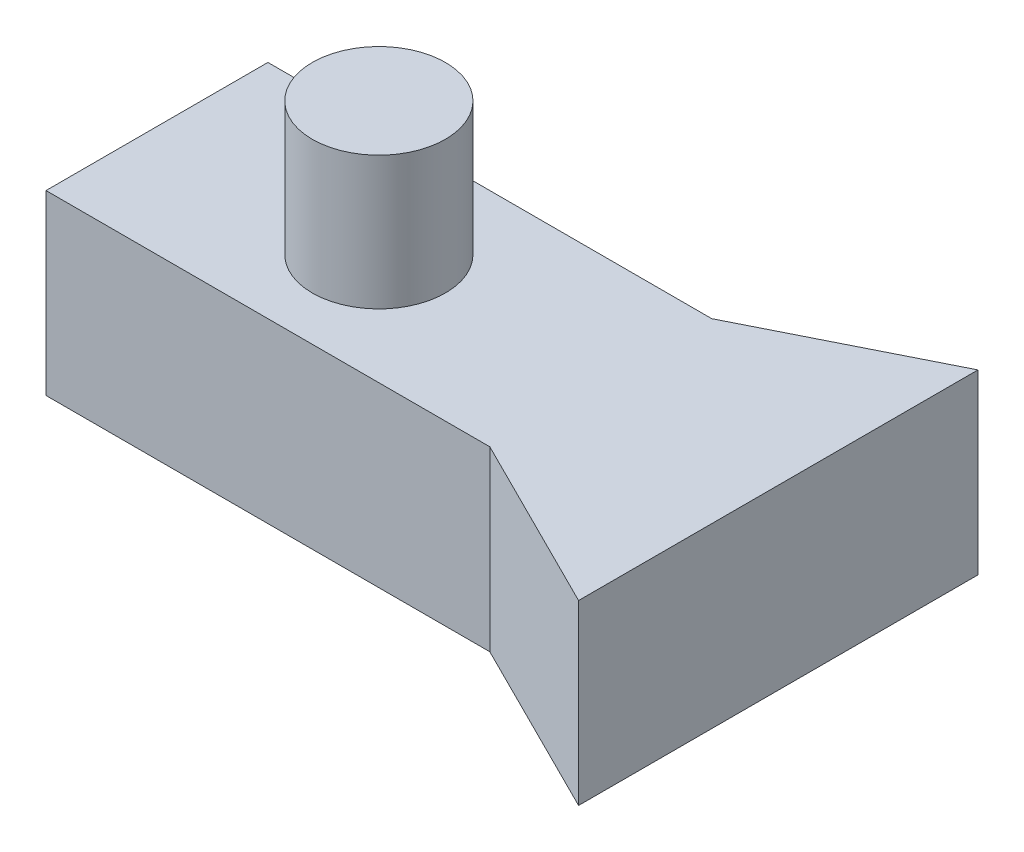
ISO-10303-21;
HEADER;
FILE_DESCRIPTION(('STEP AP214'),'2;1');
FILE_NAME('part.step','',(''),(''),'','','');
FILE_SCHEMA(('AUTOMOTIVE_DESIGN { 1 0 10303 214 1 1 1 1 }'));
ENDSEC;
DATA;
#1=APPLICATION_CONTEXT('core data for automotive mechanical design processes');
#2=APPLICATION_PROTOCOL_DEFINITION('international standard','automotive_design',2000,#1);
#3=PRODUCT_CONTEXT('',#1,'mechanical');
#4=PRODUCT('Part','Part','',(#3));
#5=PRODUCT_RELATED_PRODUCT_CATEGORY('part','',(#4));
#6=PRODUCT_DEFINITION_FORMATION('','',#4);
#7=PRODUCT_DEFINITION_CONTEXT('part definition',#1,'design');
#8=PRODUCT_DEFINITION('design','',#6,#7);
#9=PRODUCT_DEFINITION_SHAPE('','',#8);
#10=(LENGTH_UNIT() NAMED_UNIT(*) SI_UNIT(.MILLI.,.METRE.));
#11=(NAMED_UNIT(*) PLANE_ANGLE_UNIT() SI_UNIT($,.RADIAN.));
#12=(NAMED_UNIT(*) SI_UNIT($,.STERADIAN.) SOLID_ANGLE_UNIT());
#13=UNCERTAINTY_MEASURE_WITH_UNIT(LENGTH_MEASURE(1.E-05),#10,'distance_accuracy_value','');
#14=(GEOMETRIC_REPRESENTATION_CONTEXT(3) GLOBAL_UNCERTAINTY_ASSIGNED_CONTEXT((#13)) GLOBAL_UNIT_ASSIGNED_CONTEXT((#10,
#11,#12)) REPRESENTATION_CONTEXT('',''));
#15=CARTESIAN_POINT('',(0.,0.,0.));
#16=DIRECTION('',(0.,0.,1.));
#17=DIRECTION('',(1.,0.,0.));
#18=AXIS2_PLACEMENT_3D('',#15,#16,#17);
#19=CARTESIAN_POINT('',(200.,400.,-400.));
#20=DIRECTION('',(-0.447213595499958,0.,0.894427190999916));
#21=DIRECTION('',(0.894427190999916,0.,0.447213595499958));
#22=AXIS2_PLACEMENT_3D('',#19,#20,#21);
#23=PLANE('',#22);
#24=DIRECTION('',(-0.894427190999916,0.,-0.447213595499958));
#25=VECTOR('',#24,1.);
#26=CARTESIAN_POINT('',(200.,0.,-400.));
#27=LINE('',#26,#25);
#28=CARTESIAN_POINT('',(1400.,0.,200.));
#29=VERTEX_POINT('',#28);
#30=CARTESIAN_POINT('',(1000.,0.,0.));
#31=VERTEX_POINT('',#30);
#32=EDGE_CURVE('E116',#29,#31,#27,.T.);
#33=ORIENTED_EDGE('',*,*,#32,.F.);
#34=DIRECTION('',(0.,-1.,0.));
#35=VECTOR('',#34,1.);
#36=CARTESIAN_POINT('',(1400.,400.,200.));
#37=LINE('',#36,#35);
#38=CARTESIAN_POINT('',(1400.,400.,200.));
#39=VERTEX_POINT('',#38);
#40=EDGE_CURVE('E11',#39,#29,#37,.T.);
#41=ORIENTED_EDGE('',*,*,#40,.F.);
#42=DIRECTION('',(-0.894427190999916,0.,-0.447213595499958));
#43=VECTOR('',#42,1.);
#44=CARTESIAN_POINT('',(200.,400.,-400.));
#45=LINE('',#44,#43);
#46=CARTESIAN_POINT('',(1000.,400.,0.));
#47=VERTEX_POINT('',#46);
#48=EDGE_CURVE('E131',#39,#47,#45,.T.);
#49=ORIENTED_EDGE('',*,*,#48,.T.);
#50=DIRECTION('',(0.,-1.,0.));
#51=VECTOR('',#50,1.);
#52=CARTESIAN_POINT('',(1000.,400.,0.));
#53=LINE('',#52,#51);
#54=EDGE_CURVE('E79',#47,#31,#53,.T.);
#55=ORIENTED_EDGE('',*,*,#54,.T.);
#56=EDGE_LOOP('',(#33,#41,#49,#55));
#57=FACE_BOUND('',#56,.T.);
#58=ADVANCED_FACE('F35',(#57),#23,.T.);
#59=CARTESIAN_POINT('',(1400.,400.,0.));
#60=DIRECTION('',(1.,0.,0.));
#61=DIRECTION('',(0.,0.,-1.));
#62=AXIS2_PLACEMENT_3D('',#59,#60,#61);
#63=PLANE('',#62);
#64=DIRECTION('',(0.,0.,1.));
#65=VECTOR('',#64,1.);
#66=CARTESIAN_POINT('',(1400.,0.,0.));
#67=LINE('',#66,#65);
#68=CARTESIAN_POINT('',(1400.,0.,-700.));
#69=VERTEX_POINT('',#68);
#70=EDGE_CURVE('E119',#69,#29,#67,.T.);
#71=ORIENTED_EDGE('',*,*,#70,.F.);
#72=DIRECTION('',(0.,-1.,0.));
#73=VECTOR('',#72,1.);
#74=CARTESIAN_POINT('',(1400.,400.,-700.));
#75=LINE('',#74,#73);
#76=CARTESIAN_POINT('',(1400.,400.,-700.));
#77=VERTEX_POINT('',#76);
#78=EDGE_CURVE('E43',#77,#69,#75,.T.);
#79=ORIENTED_EDGE('',*,*,#78,.F.);
#80=DIRECTION('',(0.,0.,1.));
#81=VECTOR('',#80,1.);
#82=CARTESIAN_POINT('',(1400.,400.,0.));
#83=LINE('',#82,#81);
#84=EDGE_CURVE('E144',#77,#39,#83,.T.);
#85=ORIENTED_EDGE('',*,*,#84,.T.);
#86=ORIENTED_EDGE('',*,*,#40,.T.);
#87=EDGE_LOOP('',(#71,#79,#85,#86));
#88=FACE_BOUND('',#87,.T.);
#89=ADVANCED_FACE('F140',(#88),#63,.T.);
#90=CARTESIAN_POINT('',(0.,400.,0.));
#91=DIRECTION('',(-0.447213595499958,0.,-0.894427190999916));
#92=DIRECTION('',(-0.894427190999916,0.,0.447213595499958));
#93=AXIS2_PLACEMENT_3D('',#90,#91,#92);
#94=PLANE('',#93);
#95=DIRECTION('',(0.894427190999916,0.,-0.447213595499958));
#96=VECTOR('',#95,1.);
#97=CARTESIAN_POINT('',(0.,0.,0.));
#98=LINE('',#97,#96);
#99=CARTESIAN_POINT('',(1000.,0.,-500.));
#100=VERTEX_POINT('',#99);
#101=EDGE_CURVE('E123',#100,#69,#98,.T.);
#102=ORIENTED_EDGE('',*,*,#101,.F.);
#103=DIRECTION('',(0.,-1.,0.));
#104=VECTOR('',#103,1.);
#105=CARTESIAN_POINT('',(1000.,400.,-500.));
#106=LINE('',#105,#104);
#107=CARTESIAN_POINT('',(1000.,400.,-500.));
#108=VERTEX_POINT('',#107);
#109=EDGE_CURVE('E102',#108,#100,#106,.T.);
#110=ORIENTED_EDGE('',*,*,#109,.F.);
#111=DIRECTION('',(0.894427190999916,0.,-0.447213595499958));
#112=VECTOR('',#111,1.);
#113=CARTESIAN_POINT('',(0.,400.,0.));
#114=LINE('',#113,#112);
#115=EDGE_CURVE('E109',#108,#77,#114,.T.);
#116=ORIENTED_EDGE('',*,*,#115,.T.);
#117=ORIENTED_EDGE('',*,*,#78,.T.);
#118=EDGE_LOOP('',(#102,#110,#116,#117));
#119=FACE_BOUND('',#118,.T.);
#120=ADVANCED_FACE('F137',(#119),#94,.T.);
#121=CARTESIAN_POINT('',(0.,400.,-500.));
#122=DIRECTION('',(0.,0.,-1.));
#123=DIRECTION('',(-1.,0.,0.));
#124=AXIS2_PLACEMENT_3D('',#121,#122,#123);
#125=PLANE('',#124);
#126=DIRECTION('',(1.,0.,0.));
#127=VECTOR('',#126,1.);
#128=CARTESIAN_POINT('',(0.,0.,-500.));
#129=LINE('',#128,#127);
#130=CARTESIAN_POINT('',(0.,0.,-500.));
#131=VERTEX_POINT('',#130);
#132=EDGE_CURVE('E97',#131,#100,#129,.T.);
#133=ORIENTED_EDGE('',*,*,#132,.F.);
#134=DIRECTION('',(0.,-1.,0.));
#135=VECTOR('',#134,1.);
#136=CARTESIAN_POINT('',(0.,400.,-500.));
#137=LINE('',#136,#135);
#138=CARTESIAN_POINT('',(0.,400.,-500.));
#139=VERTEX_POINT('',#138);
#140=EDGE_CURVE('E92',#139,#131,#137,.T.);
#141=ORIENTED_EDGE('',*,*,#140,.F.);
#142=DIRECTION('',(1.,0.,0.));
#143=VECTOR('',#142,1.);
#144=CARTESIAN_POINT('',(0.,400.,-500.));
#145=LINE('',#144,#143);
#146=EDGE_CURVE('E95',#139,#108,#145,.T.);
#147=ORIENTED_EDGE('',*,*,#146,.T.);
#148=ORIENTED_EDGE('',*,*,#109,.T.);
#149=EDGE_LOOP('',(#133,#141,#147,#148));
#150=FACE_BOUND('',#149,.T.);
#151=ADVANCED_FACE('F94',(#150),#125,.T.);
#152=CARTESIAN_POINT('',(0.,400.,0.));
#153=DIRECTION('',(-1.,0.,0.));
#154=DIRECTION('',(0.,0.,1.));
#155=AXIS2_PLACEMENT_3D('',#152,#153,#154);
#156=PLANE('',#155);
#157=DIRECTION('',(0.,0.,-1.));
#158=VECTOR('',#157,1.);
#159=CARTESIAN_POINT('',(0.,0.,0.));
#160=LINE('',#159,#158);
#161=CARTESIAN_POINT('',(0.,0.,0.));
#162=VERTEX_POINT('',#161);
#163=EDGE_CURVE('E127',#162,#131,#160,.T.);
#164=ORIENTED_EDGE('',*,*,#163,.F.);
#165=DIRECTION('',(0.,-1.,0.));
#166=VECTOR('',#165,1.);
#167=CARTESIAN_POINT('',(0.,400.,0.));
#168=LINE('',#167,#166);
#169=CARTESIAN_POINT('',(0.,400.,0.));
#170=VERTEX_POINT('',#169);
#171=EDGE_CURVE('E72',#170,#162,#168,.T.);
#172=ORIENTED_EDGE('',*,*,#171,.F.);
#173=DIRECTION('',(0.,0.,-1.));
#174=VECTOR('',#173,1.);
#175=CARTESIAN_POINT('',(0.,400.,0.));
#176=LINE('',#175,#174);
#177=EDGE_CURVE('E106',#170,#139,#176,.T.);
#178=ORIENTED_EDGE('',*,*,#177,.T.);
#179=ORIENTED_EDGE('',*,*,#140,.T.);
#180=EDGE_LOOP('',(#164,#172,#178,#179));
#181=FACE_BOUND('',#180,.T.);
#182=ADVANCED_FACE('F111',(#181),#156,.T.);
#183=CARTESIAN_POINT('',(0.,400.,0.));
#184=DIRECTION('',(0.,0.,-1.));
#185=DIRECTION('',(-1.,0.,0.));
#186=AXIS2_PLACEMENT_3D('',#183,#184,#185);
#187=PLANE('',#186);
#188=DIRECTION('',(1.,0.,0.));
#189=VECTOR('',#188,1.);
#190=CARTESIAN_POINT('',(0.,0.,0.));
#191=LINE('',#190,#189);
#192=EDGE_CURVE('E129',#162,#31,#191,.T.);
#193=ORIENTED_EDGE('',*,*,#192,.T.);
#194=ORIENTED_EDGE('',*,*,#54,.F.);
#195=DIRECTION('',(1.,0.,0.));
#196=VECTOR('',#195,1.);
#197=CARTESIAN_POINT('',(0.,400.,0.));
#198=LINE('',#197,#196);
#199=EDGE_CURVE('E51',#170,#47,#198,.T.);
#200=ORIENTED_EDGE('',*,*,#199,.F.);
#201=ORIENTED_EDGE('',*,*,#171,.T.);
#202=EDGE_LOOP('',(#193,#194,#200,#201));
#203=FACE_BOUND('',#202,.T.);
#204=ADVANCED_FACE('F143',(#203),#187,.F.);
#205=CARTESIAN_POINT('',(0.,400.,0.));
#206=DIRECTION('',(0.,1.,0.));
#207=DIRECTION('',(0.,0.,1.));
#208=AXIS2_PLACEMENT_3D('',#205,#206,#207);
#209=PLANE('',#208);
#210=CARTESIAN_POINT('',(500.,400.,-250.));
#211=DIRECTION('',(0.,1.,0.));
#212=DIRECTION('',(0.,0.,1.));
#213=AXIS2_PLACEMENT_3D('',#210,#211,#212);
#214=CIRCLE('',#213,150.);
#215=CARTESIAN_POINT('',(500.,400.,-99.9999999999999));
#216=VERTEX_POINT('',#215);
#217=EDGE_CURVE('E148',#216,#216,#214,.T.);
#218=ORIENTED_EDGE('',*,*,#217,.F.);
#219=EDGE_LOOP('',(#218));
#220=FACE_BOUND('',#219,.T.);
#221=ORIENTED_EDGE('',*,*,#48,.F.);
#222=ORIENTED_EDGE('',*,*,#84,.F.);
#223=ORIENTED_EDGE('',*,*,#115,.F.);
#224=ORIENTED_EDGE('',*,*,#146,.F.);
#225=ORIENTED_EDGE('',*,*,#177,.F.);
#226=ORIENTED_EDGE('',*,*,#199,.T.);
#227=EDGE_LOOP('',(#221,#222,#223,#224,#225,#226));
#228=FACE_BOUND('',#227,.T.);
#229=ADVANCED_FACE('F105',(#220,#228),#209,.T.);
#230=CARTESIAN_POINT('',(0.,0.,0.));
#231=DIRECTION('',(0.,1.,0.));
#232=DIRECTION('',(0.,0.,1.));
#233=AXIS2_PLACEMENT_3D('',#230,#231,#232);
#234=PLANE('',#233);
#235=ORIENTED_EDGE('',*,*,#32,.T.);
#236=ORIENTED_EDGE('',*,*,#192,.F.);
#237=ORIENTED_EDGE('',*,*,#163,.T.);
#238=ORIENTED_EDGE('',*,*,#132,.T.);
#239=ORIENTED_EDGE('',*,*,#101,.T.);
#240=ORIENTED_EDGE('',*,*,#70,.T.);
#241=EDGE_LOOP('',(#235,#236,#237,#238,#239,#240));
#242=FACE_BOUND('',#241,.T.);
#243=ADVANCED_FACE('F142',(#242),#234,.F.);
#244=CARTESIAN_POINT('',(500.,700.,-250.));
#245=DIRECTION('',(0.,-1.,0.));
#246=DIRECTION('',(0.,0.,-1.));
#247=AXIS2_PLACEMENT_3D('',#244,#245,#246);
#248=CYLINDRICAL_SURFACE('',#247,150.);
#249=CARTESIAN_POINT('',(500.,700.,-250.));
#250=DIRECTION('',(0.,1.,0.));
#251=DIRECTION('',(0.,0.,1.));
#252=AXIS2_PLACEMENT_3D('',#249,#250,#251);
#253=CIRCLE('',#252,150.);
#254=CARTESIAN_POINT('',(500.,700.,-99.9999999999999));
#255=VERTEX_POINT('',#254);
#256=EDGE_CURVE('E120',#255,#255,#253,.T.);
#257=ORIENTED_EDGE('',*,*,#256,.F.);
#258=EDGE_LOOP('',(#257));
#259=FACE_BOUND('',#258,.T.);
#260=ORIENTED_EDGE('',*,*,#217,.T.);
#261=EDGE_LOOP('',(#260));
#262=FACE_BOUND('',#261,.T.);
#263=ADVANCED_FACE('F156',(#259,#262),#248,.T.);
#264=CARTESIAN_POINT('',(500.,700.,-250.));
#265=DIRECTION('',(0.,1.,0.));
#266=DIRECTION('',(0.,0.,1.));
#267=AXIS2_PLACEMENT_3D('',#264,#265,#266);
#268=PLANE('',#267);
#269=ORIENTED_EDGE('',*,*,#256,.T.);
#270=EDGE_LOOP('',(#269));
#271=FACE_BOUND('',#270,.T.);
#272=ADVANCED_FACE('F154',(#271),#268,.T.);
#273=CLOSED_SHELL('',(#58,#89,#120,#151,#182,#204,#229,#243,#263,#272));
#274=MANIFOLD_SOLID_BREP('B2',#273);
#275=ADVANCED_BREP_SHAPE_REPRESENTATION('',(#18,#274),#14);
#276=SHAPE_DEFINITION_REPRESENTATION(#9,#275);
ENDSEC;
END-ISO-10303-21;
